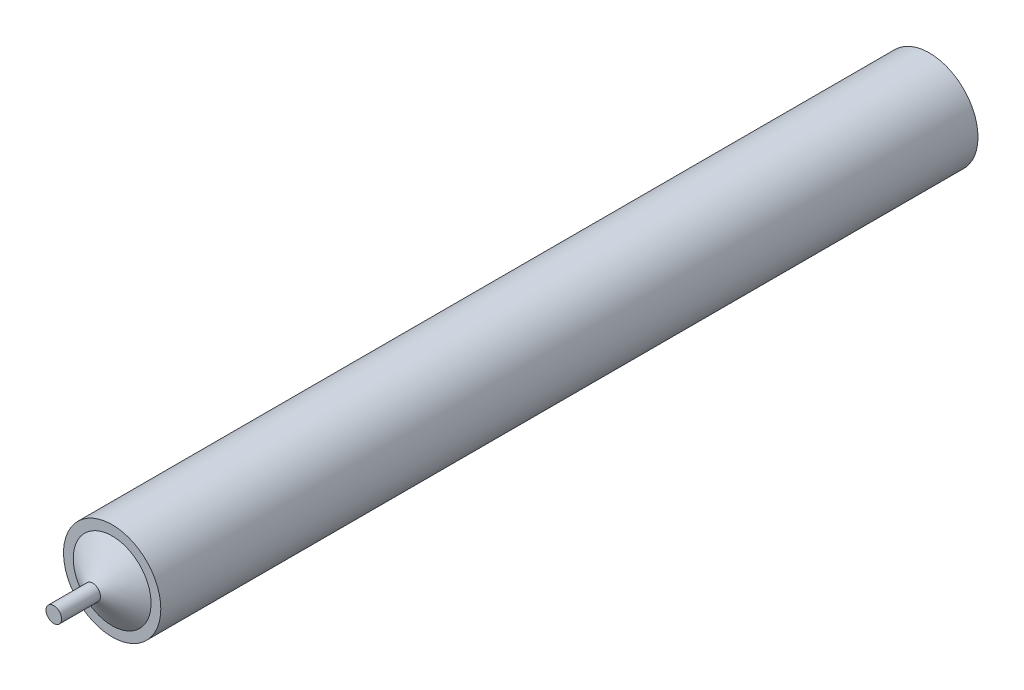
ISO-10303-21;
HEADER;
FILE_DESCRIPTION(('STEP AP214'),'2;1');
FILE_NAME('part.step','',(''),(''),'','','');
FILE_SCHEMA(('AUTOMOTIVE_DESIGN { 1 0 10303 214 1 1 1 1 }'));
ENDSEC;
DATA;
#1=APPLICATION_CONTEXT('core data for automotive mechanical design processes');
#2=APPLICATION_PROTOCOL_DEFINITION('international standard','automotive_design',2000,#1);
#3=PRODUCT_CONTEXT('',#1,'mechanical');
#4=PRODUCT('Part','Part','',(#3));
#5=PRODUCT_RELATED_PRODUCT_CATEGORY('part','',(#4));
#6=PRODUCT_DEFINITION_FORMATION('','',#4);
#7=PRODUCT_DEFINITION_CONTEXT('part definition',#1,'design');
#8=PRODUCT_DEFINITION('design','',#6,#7);
#9=PRODUCT_DEFINITION_SHAPE('','',#8);
#10=(LENGTH_UNIT() NAMED_UNIT(*) SI_UNIT(.MILLI.,.METRE.));
#11=(NAMED_UNIT(*) PLANE_ANGLE_UNIT() SI_UNIT($,.RADIAN.));
#12=(NAMED_UNIT(*) SI_UNIT($,.STERADIAN.) SOLID_ANGLE_UNIT());
#13=UNCERTAINTY_MEASURE_WITH_UNIT(LENGTH_MEASURE(1.E-05),#10,'distance_accuracy_value','');
#14=(GEOMETRIC_REPRESENTATION_CONTEXT(3) GLOBAL_UNCERTAINTY_ASSIGNED_CONTEXT((#13)) GLOBAL_UNIT_ASSIGNED_CONTEXT((#10,
#11,#12)) REPRESENTATION_CONTEXT('',''));
#15=CARTESIAN_POINT('',(0.,0.,0.));
#16=DIRECTION('',(0.,0.,1.));
#17=DIRECTION('',(1.,0.,0.));
#18=AXIS2_PLACEMENT_3D('',#15,#16,#17);
#19=CARTESIAN_POINT('',(0.,0.,420.));
#20=DIRECTION('',(0.,0.,1.));
#21=DIRECTION('',(1.,0.,0.));
#22=AXIS2_PLACEMENT_3D('',#19,#20,#21);
#23=PLANE('',#22);
#24=CARTESIAN_POINT('',(0.,0.,420.));
#25=DIRECTION('',(0.,0.,1.));
#26=DIRECTION('',(1.,0.,0.));
#27=AXIS2_PLACEMENT_3D('',#24,#25,#26);
#28=CIRCLE('',#27,25.);
#29=CARTESIAN_POINT('',(25.,0.,420.));
#30=VERTEX_POINT('',#29);
#31=EDGE_CURVE('E11',#30,#30,#28,.T.);
#32=ORIENTED_EDGE('',*,*,#31,.T.);
#33=EDGE_LOOP('',(#32));
#34=FACE_BOUND('',#33,.T.);
#35=CARTESIAN_POINT('',(0.,0.,420.));
#36=DIRECTION('',(0.,0.,1.));
#37=DIRECTION('',(1.,0.,0.));
#38=AXIS2_PLACEMENT_3D('',#35,#36,#37);
#39=CIRCLE('',#38,20.);
#40=CARTESIAN_POINT('',(-20.,0.,420.));
#41=VERTEX_POINT('',#40);
#42=EDGE_CURVE('E51',#41,#41,#39,.T.);
#43=ORIENTED_EDGE('',*,*,#42,.F.);
#44=EDGE_LOOP('',(#43));
#45=FACE_BOUND('',#44,.T.);
#46=ADVANCED_FACE('F36',(#34,#45),#23,.T.);
#47=CARTESIAN_POINT('',(0.,0.,420.));
#48=DIRECTION('',(0.,0.,-1.));
#49=DIRECTION('',(-1.,0.,0.));
#50=AXIS2_PLACEMENT_3D('',#47,#48,#49);
#51=CYLINDRICAL_SURFACE('',#50,25.);
#52=ORIENTED_EDGE('',*,*,#31,.F.);
#53=EDGE_LOOP('',(#52));
#54=FACE_BOUND('',#53,.T.);
#55=CARTESIAN_POINT('',(0.,0.,0.));
#56=DIRECTION('',(0.,0.,1.));
#57=DIRECTION('',(1.,0.,0.));
#58=AXIS2_PLACEMENT_3D('',#55,#56,#57);
#59=CIRCLE('',#58,25.);
#60=CARTESIAN_POINT('',(25.,0.,0.));
#61=VERTEX_POINT('',#60);
#62=EDGE_CURVE('E46',#61,#61,#59,.T.);
#63=ORIENTED_EDGE('',*,*,#62,.T.);
#64=EDGE_LOOP('',(#63));
#65=FACE_BOUND('',#64,.T.);
#66=ADVANCED_FACE('F38',(#54,#65),#51,.T.);
#67=CARTESIAN_POINT('',(0.,0.,0.));
#68=DIRECTION('',(0.,0.,1.));
#69=DIRECTION('',(1.,0.,0.));
#70=AXIS2_PLACEMENT_3D('',#67,#68,#69);
#71=PLANE('',#70);
#72=CARTESIAN_POINT('',(0.,0.,0.));
#73=DIRECTION('',(0.,0.,-1.));
#74=DIRECTION('',(-1.,0.,0.));
#75=AXIS2_PLACEMENT_3D('',#72,#73,#74);
#76=CIRCLE('',#75,20.);
#77=CARTESIAN_POINT('',(-20.,0.,0.));
#78=VERTEX_POINT('',#77);
#79=EDGE_CURVE('E98',#78,#78,#76,.T.);
#80=ORIENTED_EDGE('',*,*,#79,.F.);
#81=EDGE_LOOP('',(#80));
#82=FACE_BOUND('',#81,.T.);
#83=ORIENTED_EDGE('',*,*,#62,.F.);
#84=EDGE_LOOP('',(#83));
#85=FACE_BOUND('',#84,.T.);
#86=ADVANCED_FACE('F82',(#82,#85),#71,.F.);
#87=CARTESIAN_POINT('',(0.,0.,430.));
#88=DIRECTION('',(0.,0.,-1.));
#89=DIRECTION('',(-1.,0.,0.));
#90=AXIS2_PLACEMENT_3D('',#87,#88,#89);
#91=CONICAL_SURFACE('',#90,4.,1.01219701145133);
#92=CARTESIAN_POINT('',(0.,0.,430.));
#93=DIRECTION('',(0.,0.,1.));
#94=DIRECTION('',(1.,0.,0.));
#95=AXIS2_PLACEMENT_3D('',#92,#93,#94);
#96=CIRCLE('',#95,4.);
#97=CARTESIAN_POINT('',(-4.00000000000004,0.,430.));
#98=VERTEX_POINT('',#97);
#99=EDGE_CURVE('E60',#98,#98,#96,.T.);
#100=CARTESIAN_POINT('',(-4.00000000000004,0.,430.));
#101=CARTESIAN_POINT('',(-4.1666666666667,0.,429.895833333333));
#102=CARTESIAN_POINT('',(-4.33333333333337,0.,429.791666666667));
#103=CARTESIAN_POINT('',(-4.66666666666671,0.,429.583333333333));
#104=CARTESIAN_POINT('',(-4.83333333333338,0.,429.479166666667));
#105=CARTESIAN_POINT('',(-5.16666666666671,0.,429.270833333333));
#106=CARTESIAN_POINT('',(-5.33333333333338,0.,429.166666666667));
#107=CARTESIAN_POINT('',(-5.66666666666671,0.,428.958333333333));
#108=CARTESIAN_POINT('',(-5.83333333333338,0.,428.854166666667));
#109=CARTESIAN_POINT('',(-6.16666666666671,0.,428.645833333333));
#110=CARTESIAN_POINT('',(-6.33333333333338,0.,428.541666666667));
#111=CARTESIAN_POINT('',(-6.66666666666671,0.,428.333333333333));
#112=CARTESIAN_POINT('',(-6.83333333333338,0.,428.229166666667));
#113=CARTESIAN_POINT('',(-7.16666666666671,0.,428.020833333333));
#114=CARTESIAN_POINT('',(-7.33333333333338,0.,427.916666666667));
#115=CARTESIAN_POINT('',(-7.66666666666671,0.,427.708333333333));
#116=CARTESIAN_POINT('',(-7.83333333333338,0.,427.604166666667));
#117=CARTESIAN_POINT('',(-8.16666666666671,0.,427.395833333333));
#118=CARTESIAN_POINT('',(-8.33333333333337,0.,427.291666666667));
#119=CARTESIAN_POINT('',(-8.66666666666671,0.,427.083333333333));
#120=CARTESIAN_POINT('',(-8.83333333333338,0.,426.979166666667));
#121=CARTESIAN_POINT('',(-9.16666666666671,0.,426.770833333333));
#122=CARTESIAN_POINT('',(-9.33333333333338,0.,426.666666666667));
#123=CARTESIAN_POINT('',(-9.66666666666671,0.,426.458333333333));
#124=CARTESIAN_POINT('',(-9.83333333333338,0.,426.354166666667));
#125=CARTESIAN_POINT('',(-10.1666666666667,0.,426.145833333333));
#126=CARTESIAN_POINT('',(-10.3333333333334,0.,426.041666666667));
#127=CARTESIAN_POINT('',(-10.6666666666667,0.,425.833333333333));
#128=CARTESIAN_POINT('',(-10.8333333333334,0.,425.729166666667));
#129=CARTESIAN_POINT('',(-11.1666666666667,0.,425.520833333333));
#130=CARTESIAN_POINT('',(-11.3333333333334,0.,425.416666666667));
#131=CARTESIAN_POINT('',(-11.6666666666667,0.,425.208333333333));
#132=CARTESIAN_POINT('',(-11.8333333333334,0.,425.104166666667));
#133=CARTESIAN_POINT('',(-12.1666666666667,0.,424.895833333333));
#134=CARTESIAN_POINT('',(-12.3333333333334,0.,424.791666666667));
#135=CARTESIAN_POINT('',(-12.6666666666667,0.,424.583333333333));
#136=CARTESIAN_POINT('',(-12.8333333333334,0.,424.479166666667));
#137=CARTESIAN_POINT('',(-13.1666666666667,0.,424.270833333333));
#138=CARTESIAN_POINT('',(-13.3333333333334,0.,424.166666666667));
#139=CARTESIAN_POINT('',(-13.6666666666667,0.,423.958333333333));
#140=CARTESIAN_POINT('',(-13.8333333333334,0.,423.854166666667));
#141=CARTESIAN_POINT('',(-14.1666666666667,0.,423.645833333333));
#142=CARTESIAN_POINT('',(-14.3333333333334,0.,423.541666666667));
#143=CARTESIAN_POINT('',(-14.6666666666667,0.,423.333333333333));
#144=CARTESIAN_POINT('',(-14.8333333333334,0.,423.229166666667));
#145=CARTESIAN_POINT('',(-15.1666666666667,0.,423.020833333333));
#146=CARTESIAN_POINT('',(-15.3333333333334,0.,422.916666666667));
#147=CARTESIAN_POINT('',(-15.6666666666667,0.,422.708333333333));
#148=CARTESIAN_POINT('',(-15.8333333333334,0.,422.604166666667));
#149=CARTESIAN_POINT('',(-16.1666666666667,0.,422.395833333333));
#150=CARTESIAN_POINT('',(-16.3333333333334,0.,422.291666666667));
#151=CARTESIAN_POINT('',(-16.6666666666667,0.,422.083333333333));
#152=CARTESIAN_POINT('',(-16.8333333333334,0.,421.979166666667));
#153=CARTESIAN_POINT('',(-17.1666666666667,0.,421.770833333333));
#154=CARTESIAN_POINT('',(-17.3333333333334,0.,421.666666666667));
#155=CARTESIAN_POINT('',(-17.6666666666667,0.,421.458333333333));
#156=CARTESIAN_POINT('',(-17.8333333333334,0.,421.354166666667));
#157=CARTESIAN_POINT('',(-18.1666666666667,0.,421.145833333333));
#158=CARTESIAN_POINT('',(-18.3333333333334,0.,421.041666666667));
#159=CARTESIAN_POINT('',(-18.6666666666667,0.,420.833333333333));
#160=CARTESIAN_POINT('',(-18.8333333333334,0.,420.729166666667));
#161=CARTESIAN_POINT('',(-19.1666666666667,0.,420.520833333333));
#162=CARTESIAN_POINT('',(-19.3333333333334,0.,420.416666666667));
#163=CARTESIAN_POINT('',(-19.6666666666667,0.,420.208333333333));
#164=CARTESIAN_POINT('',(-19.8333333333334,0.,420.104166666667));
#165=CARTESIAN_POINT('',(-20.,0.,420.));
#166=B_SPLINE_CURVE_WITH_KNOTS('',3,(#100,#101,#102,#103,#104,#105,#106,#107,#108,#109,#110,
#111,#112,#113,#114,#115,#116,#117,#118,#119,#120,#121,#122,#123,#124,#125,#126,#127,#128,#129,
#130,#131,#132,#133,#134,#135,#136,#137,#138,#139,#140,#141,#142,#143,#144,#145,#146,#147,#148,
#149,#150,#151,#152,#153,#154,#155,#156,#157,#158,#159,#160,#161,#162,#163,#164,#165),
.UNSPECIFIED.,.F.,.F.,(4,2,2,2,2,2,2,2,2,2,2,2,2,2,2,2,2,2,2,2,2,2,2,2,2,2,2,2,2,2,2,2,4),(0.,
0.589623820753564,1.1792476415071,1.76887146226063,2.35849528301417,2.9481191037677,
3.53774292452123,4.12736674527477,4.7169905660283,5.30661438678187,5.8962382075354,
6.48586202828893,7.07548584904247,7.665109669796,8.25473349054954,8.84435731130307,
9.43398113205663,10.0236049528102,10.6132287735637,11.2028525943172,11.7924764150708,
12.3821002358243,12.9717240565778,13.5613478773314,14.1509716980849,14.7405955188385,
15.330219339592,15.9198431603455,16.5094669810991,17.0990908018526,17.6887146226061,
18.2783384433597,18.8679622641132),.UNSPECIFIED.);
#167=EDGE_CURVE('BSEAM76',#98,#41,#166,.T.);
#168=ORIENTED_EDGE('',*,*,#99,.F.);
#169=ORIENTED_EDGE('',*,*,#42,.T.);
#170=ORIENTED_EDGE('',*,*,#167,.T.);
#171=ORIENTED_EDGE('',*,*,#167,.F.);
#172=EDGE_LOOP('',(#168,#170,#169,#171));
#173=FACE_BOUND('',#172,.T.);
#174=ADVANCED_FACE('F76',(#173),#91,.T.);
#175=CARTESIAN_POINT('',(0.,0.,450.));
#176=DIRECTION('',(0.,0.,-1.));
#177=DIRECTION('',(-1.,0.,0.));
#178=AXIS2_PLACEMENT_3D('',#175,#176,#177);
#179=CYLINDRICAL_SURFACE('',#178,4.);
#180=CARTESIAN_POINT('',(0.,0.,450.));
#181=DIRECTION('',(0.,0.,1.));
#182=DIRECTION('',(1.,0.,0.));
#183=AXIS2_PLACEMENT_3D('',#180,#181,#182);
#184=CIRCLE('',#183,4.);
#185=CARTESIAN_POINT('',(4.,0.,450.));
#186=VERTEX_POINT('',#185);
#187=EDGE_CURVE('E95',#186,#186,#184,.T.);
#188=ORIENTED_EDGE('',*,*,#187,.F.);
#189=EDGE_LOOP('',(#188));
#190=FACE_BOUND('',#189,.T.);
#191=ORIENTED_EDGE('',*,*,#99,.T.);
#192=EDGE_LOOP('',(#191));
#193=FACE_BOUND('',#192,.T.);
#194=ADVANCED_FACE('F65',(#190,#193),#179,.T.);
#195=CARTESIAN_POINT('',(0.,0.,450.));
#196=DIRECTION('',(0.,0.,1.));
#197=DIRECTION('',(1.,0.,0.));
#198=AXIS2_PLACEMENT_3D('',#195,#196,#197);
#199=PLANE('',#198);
#200=ORIENTED_EDGE('',*,*,#187,.T.);
#201=EDGE_LOOP('',(#200));
#202=FACE_BOUND('',#201,.T.);
#203=ADVANCED_FACE('F75',(#202),#199,.T.);
#204=CARTESIAN_POINT('',(-8.01209827383846,18.3250179058672,0.));
#205=CARTESIAN_POINT('',(-0.355363051947487,2.47461453590465,-10.));
#206=CARTESIAN_POINT('',(28.637937537896,34.3492144535441,0.));
#207=CARTESIAN_POINT('',(4.5938660198618,3.18534063979962,-10.));
#208=CARTESIAN_POINT('',(44.6621340855729,-2.30082135819031,0.));
#209=CARTESIAN_POINT('',(5.30459212375678,-1.76388843200967,-10.));
#210=CARTESIAN_POINT('',(8.01209827383847,-18.3250179058672,0.));
#211=CARTESIAN_POINT('',(0.355363051947488,-2.47461453590465,-10.));
#212=CARTESIAN_POINT('',(-28.637937537896,-34.3492144535442,0.));
#213=CARTESIAN_POINT('',(-4.5938660198618,-3.18534063979962,-10.));
#214=CARTESIAN_POINT('',(-44.6621340855729,2.30082135819031,0.));
#215=CARTESIAN_POINT('',(-5.30459212375678,1.76388843200967,-10.));
#216=CARTESIAN_POINT('',(-8.01209827383846,18.3250179058672,0.));
#217=CARTESIAN_POINT('',(-0.355363051947487,2.47461453590465,-10.));
#218=(BOUNDED_SURFACE() B_SPLINE_SURFACE(3,1,((#204,#205),(#206,#207),(#208,#209),(#210,#211),
(#212,#213),(#214,#215),(#216,#217)),.UNSPECIFIED.,.T.,.F.,.F.) B_SPLINE_SURFACE_WITH_KNOTS((4,
3,4),(2,2),(0.,0.5,1.),(0.,1.),
.UNSPECIFIED.) GEOMETRIC_REPRESENTATION_ITEM() RATIONAL_B_SPLINE_SURFACE(((1.,1.),
(0.333333333333334,0.333333333333334),(0.333333333333334,0.333333333333334),(1.,1.),
(0.333333333333333,0.333333333333333),(0.333333333333333,0.333333333333333),(1.,1.))) REPRESENTATION_ITEM('') SURFACE());
#219=CARTESIAN_POINT('',(-0.355363051947504,2.47461453590468,-9.99999999999998));
#220=CARTESIAN_POINT('',(-5.30459212375687,1.76388843200967,-9.99999999999998));
#221=CARTESIAN_POINT('',(-4.59386601986186,-3.18534063979969,-9.99999999999998));
#222=CARTESIAN_POINT('',(0.355363051947505,-2.47461453590468,-9.99999999999998));
#223=CARTESIAN_POINT('',(5.30459212375686,-1.76388843200967,-9.99999999999998));
#224=CARTESIAN_POINT('',(4.59386601986186,3.18534063979969,-9.99999999999998));
#225=CARTESIAN_POINT('',(-0.355363051947504,2.47461453590468,-9.99999999999998));
#226=(BOUNDED_CURVE() B_SPLINE_CURVE(3,(#219,#220,#221,#222,#223,#224,#225),.UNSPECIFIED.,.T.,
.F.) B_SPLINE_CURVE_WITH_KNOTS((4,3,4),(0.,0.5,1.),
.UNSPECIFIED.) CURVE() GEOMETRIC_REPRESENTATION_ITEM() RATIONAL_B_SPLINE_CURVE((1.,
0.333333333333333,0.333333333333333,1.,0.333333333333334,0.333333333333334,1.)) REPRESENTATION_ITEM(''));
#227=CARTESIAN_POINT('',(2.50000000000004,0.,-9.99999999999998));
#228=VERTEX_POINT('',#227);
#229=EDGE_CURVE('E155',#228,#228,#226,.F.);
#230=ORIENTED_EDGE('',*,*,#79,.T.);
#231=EDGE_LOOP('',(#230));
#232=FACE_BOUND('',#231,.T.);
#233=ORIENTED_EDGE('',*,*,#229,.F.);
#234=EDGE_LOOP('',(#233));
#235=FACE_BOUND('',#234,.T.);
#236=ADVANCED_FACE('F107',(#232,#235),#218,.T.);
#237=CARTESIAN_POINT('',(0.,0.,15.));
#238=DIRECTION('',(0.,0.,-1.));
#239=DIRECTION('',(-1.,0.,0.));
#240=AXIS2_PLACEMENT_3D('',#237,#238,#239);
#241=CYLINDRICAL_SURFACE('',#240,2.5);
#242=CARTESIAN_POINT('',(0.,0.,15.));
#243=DIRECTION('',(0.,0.,-1.));
#244=DIRECTION('',(-1.,0.,0.));
#245=AXIS2_PLACEMENT_3D('',#242,#243,#244);
#246=CIRCLE('',#245,2.5);
#247=CARTESIAN_POINT('',(-2.5,0.,15.));
#248=VERTEX_POINT('',#247);
#249=EDGE_CURVE('E101',#248,#248,#246,.T.);
#250=ORIENTED_EDGE('',*,*,#249,.F.);
#251=EDGE_LOOP('',(#250));
#252=FACE_BOUND('',#251,.T.);
#253=ORIENTED_EDGE('',*,*,#229,.T.);
#254=EDGE_LOOP('',(#253));
#255=FACE_BOUND('',#254,.T.);
#256=ADVANCED_FACE('F117',(#252,#255),#241,.F.);
#257=CARTESIAN_POINT('',(0.,0.,15.));
#258=DIRECTION('',(0.,0.,-1.));
#259=DIRECTION('',(-1.,0.,0.));
#260=AXIS2_PLACEMENT_3D('',#257,#258,#259);
#261=PLANE('',#260);
#262=ORIENTED_EDGE('',*,*,#249,.T.);
#263=EDGE_LOOP('',(#262));
#264=FACE_BOUND('',#263,.T.);
#265=ADVANCED_FACE('F127',(#264),#261,.T.);
#266=CLOSED_SHELL('',(#46,#66,#86,#174,#194,#203,#236,#256,#265));
#267=MANIFOLD_SOLID_BREP('B2',#266);
#268=ADVANCED_BREP_SHAPE_REPRESENTATION('',(#18,#267),#14);
#269=SHAPE_DEFINITION_REPRESENTATION(#9,#268);
ENDSEC;
END-ISO-10303-21;
